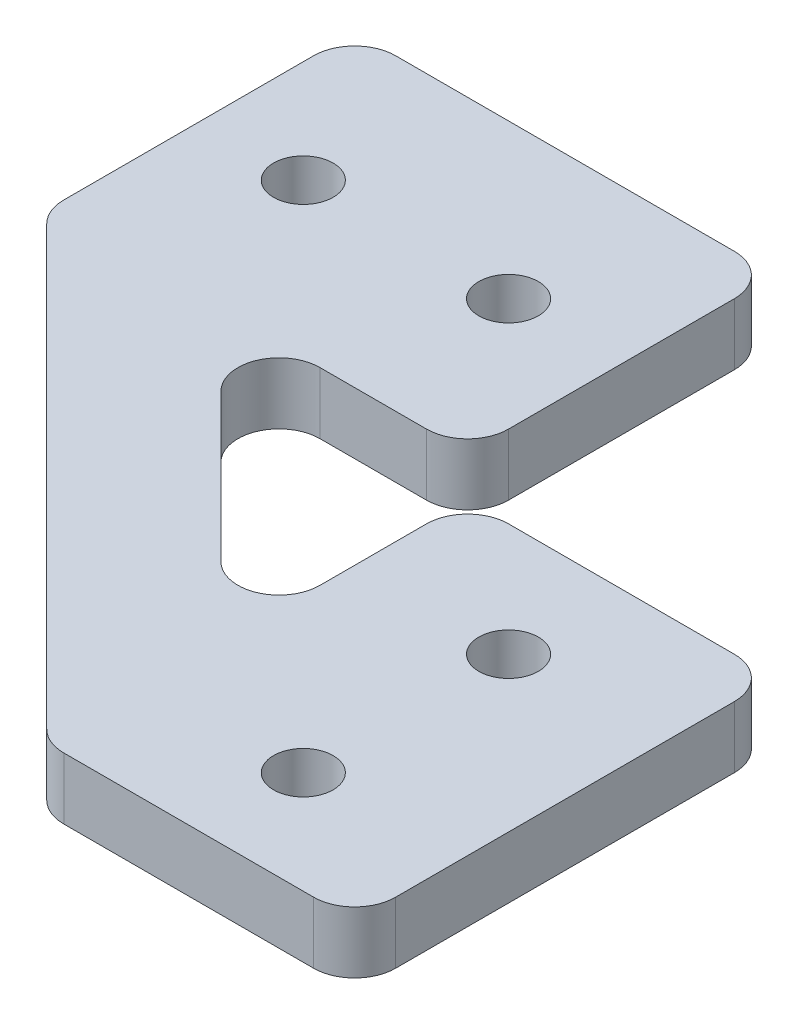
ISO-10303-21;
HEADER;
FILE_DESCRIPTION(('STEP AP214'),'2;1');
FILE_NAME('part.step','',(''),(''),'','','');
FILE_SCHEMA(('AUTOMOTIVE_DESIGN { 1 0 10303 214 1 1 1 1 }'));
ENDSEC;
DATA;
#1=APPLICATION_CONTEXT('core data for automotive mechanical design processes');
#2=APPLICATION_PROTOCOL_DEFINITION('international standard','automotive_design',2000,#1);
#3=PRODUCT_CONTEXT('',#1,'mechanical');
#4=PRODUCT('Part','Part','',(#3));
#5=PRODUCT_RELATED_PRODUCT_CATEGORY('part','',(#4));
#6=PRODUCT_DEFINITION_FORMATION('','',#4);
#7=PRODUCT_DEFINITION_CONTEXT('part definition',#1,'design');
#8=PRODUCT_DEFINITION('design','',#6,#7);
#9=PRODUCT_DEFINITION_SHAPE('','',#8);
#10=(LENGTH_UNIT() NAMED_UNIT(*) SI_UNIT(.MILLI.,.METRE.));
#11=(NAMED_UNIT(*) PLANE_ANGLE_UNIT() SI_UNIT($,.RADIAN.));
#12=(NAMED_UNIT(*) SI_UNIT($,.STERADIAN.) SOLID_ANGLE_UNIT());
#13=UNCERTAINTY_MEASURE_WITH_UNIT(LENGTH_MEASURE(1.E-05),#10,'distance_accuracy_value','');
#14=(GEOMETRIC_REPRESENTATION_CONTEXT(3) GLOBAL_UNCERTAINTY_ASSIGNED_CONTEXT((#13)) GLOBAL_UNIT_ASSIGNED_CONTEXT((#10,
#11,#12)) REPRESENTATION_CONTEXT('',''));
#15=CARTESIAN_POINT('',(0.,0.,0.));
#16=DIRECTION('',(0.,0.,1.));
#17=DIRECTION('',(1.,0.,0.));
#18=AXIS2_PLACEMENT_3D('',#15,#16,#17);
#19=CARTESIAN_POINT('',(0.,3.,0.));
#20=DIRECTION('',(0.,-1.,0.));
#21=DIRECTION('',(0.,0.,-1.));
#22=AXIS2_PLACEMENT_3D('',#19,#20,#21);
#23=PLANE('',#22);
#24=DIRECTION('',(0.,0.,-1.));
#25=VECTOR('',#24,1.);
#26=CARTESIAN_POINT('',(0.,3.,0.));
#27=LINE('',#26,#25);
#28=CARTESIAN_POINT('',(0.,3.,35.5));
#29=VERTEX_POINT('',#28);
#30=CARTESIAN_POINT('',(0.,3.,19.));
#31=VERTEX_POINT('',#30);
#32=EDGE_CURVE('E206',#29,#31,#27,.T.);
#33=ORIENTED_EDGE('',*,*,#32,.T.);
#34=CARTESIAN_POINT('',(-2.,3.,19.));
#35=DIRECTION('',(0.,-1.,0.));
#36=DIRECTION('',(0.,0.,-1.));
#37=AXIS2_PLACEMENT_3D('',#34,#35,#36);
#38=CIRCLE('',#37,2.);
#39=CARTESIAN_POINT('',(-2.,3.,17.));
#40=VERTEX_POINT('',#39);
#41=EDGE_CURVE('E267',#31,#40,#38,.F.);
#42=ORIENTED_EDGE('',*,*,#41,.T.);
#43=DIRECTION('',(1.,0.,0.));
#44=VECTOR('',#43,1.);
#45=CARTESIAN_POINT('',(0.,3.,17.));
#46=LINE('',#45,#44);
#47=CARTESIAN_POINT('',(-13.,3.,17.));
#48=VERTEX_POINT('',#47);
#49=EDGE_CURVE('E477',#48,#40,#46,.T.);
#50=ORIENTED_EDGE('',*,*,#49,.F.);
#51=CARTESIAN_POINT('',(-13.,3.,19.));
#52=DIRECTION('',(0.,-1.,0.));
#53=DIRECTION('',(0.,0.,-1.));
#54=AXIS2_PLACEMENT_3D('',#51,#52,#53);
#55=CIRCLE('',#54,2.);
#56=CARTESIAN_POINT('',(-15.,3.,19.));
#57=VERTEX_POINT('',#56);
#58=EDGE_CURVE('E264',#48,#57,#55,.F.);
#59=ORIENTED_EDGE('',*,*,#58,.T.);
#60=DIRECTION('',(0.,0.,1.));
#61=VECTOR('',#60,1.);
#62=CARTESIAN_POINT('',(-15.,3.,37.5));
#63=LINE('',#62,#61);
#64=CARTESIAN_POINT('',(-15.,3.,24.1862915010152));
#65=VERTEX_POINT('',#64);
#66=EDGE_CURVE('E368',#57,#65,#63,.T.);
#67=ORIENTED_EDGE('',*,*,#66,.T.);
#68=CARTESIAN_POINT('',(-17.,3.,24.1862915010152));
#69=DIRECTION('',(0.,-1.,0.));
#70=DIRECTION('',(0.,0.,-1.));
#71=AXIS2_PLACEMENT_3D('',#68,#69,#70);
#72=CIRCLE('',#71,2.);
#73=CARTESIAN_POINT('',(-18.4142135623731,3.,25.6005050633883));
#74=VERTEX_POINT('',#73);
#75=EDGE_CURVE('E347',#65,#74,#72,.T.);
#76=ORIENTED_EDGE('',*,*,#75,.T.);
#77=DIRECTION('',(-0.707106781186548,0.,-0.707106781186547));
#78=VECTOR('',#77,1.);
#79=CARTESIAN_POINT('',(-15.,3.,29.0147186257614));
#80=LINE('',#79,#78);
#81=CARTESIAN_POINT('',(-25.6005050633883,3.,18.4142135623731));
#82=VERTEX_POINT('',#81);
#83=EDGE_CURVE('E359',#74,#82,#80,.T.);
#84=ORIENTED_EDGE('',*,*,#83,.T.);
#85=CARTESIAN_POINT('',(-24.1862915010152,3.,17.));
#86=DIRECTION('',(0.,-1.,0.));
#87=DIRECTION('',(0.,0.,-1.));
#88=AXIS2_PLACEMENT_3D('',#85,#86,#87);
#89=CIRCLE('',#88,2.);
#90=CARTESIAN_POINT('',(-24.1862915010152,3.,15.));
#91=VERTEX_POINT('',#90);
#92=EDGE_CURVE('E54',#82,#91,#89,.T.);
#93=ORIENTED_EDGE('',*,*,#92,.T.);
#94=DIRECTION('',(1.,0.,0.));
#95=VECTOR('',#94,1.);
#96=CARTESIAN_POINT('',(-37.5,3.,15.));
#97=LINE('',#96,#95);
#98=CARTESIAN_POINT('',(-19.,3.,15.));
#99=VERTEX_POINT('',#98);
#100=EDGE_CURVE('E357',#91,#99,#97,.T.);
#101=ORIENTED_EDGE('',*,*,#100,.T.);
#102=CARTESIAN_POINT('',(-19.,3.,13.));
#103=DIRECTION('',(0.,-1.,0.));
#104=DIRECTION('',(0.,0.,-1.));
#105=AXIS2_PLACEMENT_3D('',#102,#103,#104);
#106=CIRCLE('',#105,2.);
#107=CARTESIAN_POINT('',(-17.,3.,13.));
#108=VERTEX_POINT('',#107);
#109=EDGE_CURVE('E258',#99,#108,#106,.F.);
#110=ORIENTED_EDGE('',*,*,#109,.T.);
#111=DIRECTION('',(0.,0.,1.));
#112=VECTOR('',#111,1.);
#113=CARTESIAN_POINT('',(-17.,3.,0.));
#114=LINE('',#113,#112);
#115=CARTESIAN_POINT('',(-17.,3.,2.));
#116=VERTEX_POINT('',#115);
#117=EDGE_CURVE('E483',#116,#108,#114,.T.);
#118=ORIENTED_EDGE('',*,*,#117,.F.);
#119=CARTESIAN_POINT('',(-19.,3.,2.));
#120=DIRECTION('',(0.,-1.,0.));
#121=DIRECTION('',(0.,0.,-1.));
#122=AXIS2_PLACEMENT_3D('',#119,#120,#121);
#123=CIRCLE('',#122,2.);
#124=CARTESIAN_POINT('',(-19.,3.,0.));
#125=VERTEX_POINT('',#124);
#126=EDGE_CURVE('E261',#116,#125,#123,.F.);
#127=ORIENTED_EDGE('',*,*,#126,.T.);
#128=DIRECTION('',(-1.,0.,0.));
#129=VECTOR('',#128,1.);
#130=CARTESIAN_POINT('',(0.,3.,0.));
#131=LINE('',#130,#129);
#132=CARTESIAN_POINT('',(-35.5,3.,0.));
#133=VERTEX_POINT('',#132);
#134=EDGE_CURVE('E421',#125,#133,#131,.T.);
#135=ORIENTED_EDGE('',*,*,#134,.T.);
#136=CARTESIAN_POINT('',(-35.5,3.,2.));
#137=DIRECTION('',(0.,-1.,0.));
#138=DIRECTION('',(0.,0.,-1.));
#139=AXIS2_PLACEMENT_3D('',#136,#137,#138);
#140=CIRCLE('',#139,2.);
#141=CARTESIAN_POINT('',(-37.5,3.,2.));
#142=VERTEX_POINT('',#141);
#143=EDGE_CURVE('E249',#133,#142,#140,.F.);
#144=ORIENTED_EDGE('',*,*,#143,.T.);
#145=DIRECTION('',(0.,0.,1.));
#146=VECTOR('',#145,1.);
#147=CARTESIAN_POINT('',(-37.5,3.,0.));
#148=LINE('',#147,#146);
#149=CARTESIAN_POINT('',(-37.5,3.,14.1715728752538));
#150=VERTEX_POINT('',#149);
#151=EDGE_CURVE('E369',#142,#150,#148,.T.);
#152=ORIENTED_EDGE('',*,*,#151,.T.);
#153=CARTESIAN_POINT('',(-35.5,3.,14.1715728752538));
#154=DIRECTION('',(0.,-1.,0.));
#155=DIRECTION('',(0.,0.,-1.));
#156=AXIS2_PLACEMENT_3D('',#153,#154,#155);
#157=CIRCLE('',#156,2.);
#158=CARTESIAN_POINT('',(-36.9142135623731,3.,15.5857864376269));
#159=VERTEX_POINT('',#158);
#160=EDGE_CURVE('E252',#150,#159,#157,.F.);
#161=ORIENTED_EDGE('',*,*,#160,.T.);
#162=DIRECTION('',(0.707106781186548,0.,0.707106781186547));
#163=VECTOR('',#162,1.);
#164=CARTESIAN_POINT('',(-37.5,3.,15.));
#165=LINE('',#164,#163);
#166=CARTESIAN_POINT('',(-15.5857864376269,3.,36.9142135623731));
#167=VERTEX_POINT('',#166);
#168=EDGE_CURVE('E390',#159,#167,#165,.T.);
#169=ORIENTED_EDGE('',*,*,#168,.T.);
#170=CARTESIAN_POINT('',(-14.1715728752538,3.,35.5));
#171=DIRECTION('',(0.,-1.,0.));
#172=DIRECTION('',(0.,0.,-1.));
#173=AXIS2_PLACEMENT_3D('',#170,#171,#172);
#174=CIRCLE('',#173,2.);
#175=CARTESIAN_POINT('',(-14.1715728752538,3.,37.5));
#176=VERTEX_POINT('',#175);
#177=EDGE_CURVE('E255',#167,#176,#174,.F.);
#178=ORIENTED_EDGE('',*,*,#177,.T.);
#179=DIRECTION('',(1.,0.,0.));
#180=VECTOR('',#179,1.);
#181=CARTESIAN_POINT('',(0.,3.,37.5));
#182=LINE('',#181,#180);
#183=CARTESIAN_POINT('',(-1.99999999999999,3.,37.5));
#184=VERTEX_POINT('',#183);
#185=EDGE_CURVE('E209',#176,#184,#182,.T.);
#186=ORIENTED_EDGE('',*,*,#185,.T.);
#187=CARTESIAN_POINT('',(-2.,3.,35.5));
#188=DIRECTION('',(0.,-1.,0.));
#189=DIRECTION('',(0.,0.,-1.));
#190=AXIS2_PLACEMENT_3D('',#187,#188,#189);
#191=CIRCLE('',#190,2.);
#192=EDGE_CURVE('E246',#184,#29,#191,.F.);
#193=ORIENTED_EDGE('',*,*,#192,.T.);
#194=EDGE_LOOP('',(#33,#42,#50,#59,#67,#76,#84,#93,#101,#110,#118,#127,#135,#144,#152,#161,#169,
#178,#186,#193));
#195=FACE_BOUND('',#194,.T.);
#196=CARTESIAN_POINT('',(-22.5,3.,7.5));
#197=DIRECTION('',(0.,1.,0.));
#198=DIRECTION('',(0.,0.,1.));
#199=AXIS2_PLACEMENT_3D('',#196,#197,#198);
#200=CIRCLE('',#199,1.45);
#201=CARTESIAN_POINT('',(-22.5,3.,8.95));
#202=VERTEX_POINT('',#201);
#203=EDGE_CURVE('E218',#202,#202,#200,.T.);
#204=ORIENTED_EDGE('',*,*,#203,.F.);
#205=EDGE_LOOP('',(#204));
#206=FACE_BOUND('',#205,.T.);
#207=CARTESIAN_POINT('',(-32.5,3.,7.5));
#208=DIRECTION('',(0.,1.,0.));
#209=DIRECTION('',(0.,0.,1.));
#210=AXIS2_PLACEMENT_3D('',#207,#208,#209);
#211=CIRCLE('',#210,1.45);
#212=CARTESIAN_POINT('',(-32.5,3.,8.95));
#213=VERTEX_POINT('',#212);
#214=EDGE_CURVE('E409',#213,#213,#211,.T.);
#215=ORIENTED_EDGE('',*,*,#214,.F.);
#216=EDGE_LOOP('',(#215));
#217=FACE_BOUND('',#216,.T.);
#218=CARTESIAN_POINT('',(-7.5,3.,22.5));
#219=DIRECTION('',(0.,1.,0.));
#220=DIRECTION('',(0.,0.,1.));
#221=AXIS2_PLACEMENT_3D('',#218,#219,#220);
#222=CIRCLE('',#221,1.45);
#223=CARTESIAN_POINT('',(-7.5,3.,23.95));
#224=VERTEX_POINT('',#223);
#225=EDGE_CURVE('E401',#224,#224,#222,.T.);
#226=ORIENTED_EDGE('',*,*,#225,.F.);
#227=EDGE_LOOP('',(#226));
#228=FACE_BOUND('',#227,.T.);
#229=CARTESIAN_POINT('',(-7.5,3.,32.5));
#230=DIRECTION('',(0.,1.,0.));
#231=DIRECTION('',(0.,0.,1.));
#232=AXIS2_PLACEMENT_3D('',#229,#230,#231);
#233=CIRCLE('',#232,1.45);
#234=CARTESIAN_POINT('',(-7.5,3.,33.95));
#235=VERTEX_POINT('',#234);
#236=EDGE_CURVE('E384',#235,#235,#233,.T.);
#237=ORIENTED_EDGE('',*,*,#236,.F.);
#238=EDGE_LOOP('',(#237));
#239=FACE_BOUND('',#238,.T.);
#240=ADVANCED_FACE('F45',(#195,#206,#217,#228,#239),#23,.F.);
#241=CARTESIAN_POINT('',(0.,0.,0.));
#242=DIRECTION('',(0.,-1.,0.));
#243=DIRECTION('',(0.,0.,-1.));
#244=AXIS2_PLACEMENT_3D('',#241,#242,#243);
#245=PLANE('',#244);
#246=DIRECTION('',(1.,0.,0.));
#247=VECTOR('',#246,1.);
#248=CARTESIAN_POINT('',(0.,0.,17.));
#249=LINE('',#248,#247);
#250=CARTESIAN_POINT('',(-13.,0.,17.));
#251=VERTEX_POINT('',#250);
#252=CARTESIAN_POINT('',(-2.,0.,17.));
#253=VERTEX_POINT('',#252);
#254=EDGE_CURVE('E394',#251,#253,#249,.T.);
#255=ORIENTED_EDGE('',*,*,#254,.T.);
#256=CARTESIAN_POINT('',(-2.,0.,19.));
#257=DIRECTION('',(0.,-1.,0.));
#258=DIRECTION('',(0.,0.,-1.));
#259=AXIS2_PLACEMENT_3D('',#256,#257,#258);
#260=CIRCLE('',#259,2.);
#261=CARTESIAN_POINT('',(0.,0.,19.));
#262=VERTEX_POINT('',#261);
#263=EDGE_CURVE('E215',#253,#262,#260,.T.);
#264=ORIENTED_EDGE('',*,*,#263,.T.);
#265=DIRECTION('',(0.,0.,-1.));
#266=VECTOR('',#265,1.);
#267=CARTESIAN_POINT('',(0.,0.,0.));
#268=LINE('',#267,#266);
#269=CARTESIAN_POINT('',(0.,0.,35.5));
#270=VERTEX_POINT('',#269);
#271=EDGE_CURVE('E203',#270,#262,#268,.T.);
#272=ORIENTED_EDGE('',*,*,#271,.F.);
#273=CARTESIAN_POINT('',(-2.,0.,35.5));
#274=DIRECTION('',(0.,-1.,0.));
#275=DIRECTION('',(0.,0.,-1.));
#276=AXIS2_PLACEMENT_3D('',#273,#274,#275);
#277=CIRCLE('',#276,2.);
#278=CARTESIAN_POINT('',(-1.99999999999999,0.,37.5));
#279=VERTEX_POINT('',#278);
#280=EDGE_CURVE('E185',#270,#279,#277,.T.);
#281=ORIENTED_EDGE('',*,*,#280,.T.);
#282=DIRECTION('',(1.,0.,0.));
#283=VECTOR('',#282,1.);
#284=CARTESIAN_POINT('',(0.,0.,37.5));
#285=LINE('',#284,#283);
#286=CARTESIAN_POINT('',(-14.1715728752538,0.,37.5));
#287=VERTEX_POINT('',#286);
#288=EDGE_CURVE('E241',#287,#279,#285,.T.);
#289=ORIENTED_EDGE('',*,*,#288,.F.);
#290=CARTESIAN_POINT('',(-14.1715728752538,0.,35.5));
#291=DIRECTION('',(0.,-1.,0.));
#292=DIRECTION('',(0.,0.,-1.));
#293=AXIS2_PLACEMENT_3D('',#290,#291,#292);
#294=CIRCLE('',#293,2.);
#295=CARTESIAN_POINT('',(-15.5857864376269,0.,36.9142135623731));
#296=VERTEX_POINT('',#295);
#297=EDGE_CURVE('E280',#287,#296,#294,.T.);
#298=ORIENTED_EDGE('',*,*,#297,.T.);
#299=DIRECTION('',(0.707106781186548,0.,0.707106781186547));
#300=VECTOR('',#299,1.);
#301=CARTESIAN_POINT('',(-37.5,0.,15.));
#302=LINE('',#301,#300);
#303=CARTESIAN_POINT('',(-36.9142135623731,0.,15.5857864376269));
#304=VERTEX_POINT('',#303);
#305=EDGE_CURVE('E379',#304,#296,#302,.T.);
#306=ORIENTED_EDGE('',*,*,#305,.F.);
#307=CARTESIAN_POINT('',(-35.5,0.,14.1715728752538));
#308=DIRECTION('',(0.,-1.,0.));
#309=DIRECTION('',(0.,0.,-1.));
#310=AXIS2_PLACEMENT_3D('',#307,#308,#309);
#311=CIRCLE('',#310,2.);
#312=CARTESIAN_POINT('',(-37.5,0.,14.1715728752538));
#313=VERTEX_POINT('',#312);
#314=EDGE_CURVE('E277',#304,#313,#311,.T.);
#315=ORIENTED_EDGE('',*,*,#314,.T.);
#316=DIRECTION('',(0.,0.,1.));
#317=VECTOR('',#316,1.);
#318=CARTESIAN_POINT('',(-37.5,0.,0.));
#319=LINE('',#318,#317);
#320=CARTESIAN_POINT('',(-37.5,0.,2.));
#321=VERTEX_POINT('',#320);
#322=EDGE_CURVE('E223',#321,#313,#319,.T.);
#323=ORIENTED_EDGE('',*,*,#322,.F.);
#324=CARTESIAN_POINT('',(-35.5,0.,2.));
#325=DIRECTION('',(0.,-1.,0.));
#326=DIRECTION('',(0.,0.,-1.));
#327=AXIS2_PLACEMENT_3D('',#324,#325,#326);
#328=CIRCLE('',#327,2.);
#329=CARTESIAN_POINT('',(-35.5,0.,0.));
#330=VERTEX_POINT('',#329);
#331=EDGE_CURVE('E195',#321,#330,#328,.T.);
#332=ORIENTED_EDGE('',*,*,#331,.T.);
#333=DIRECTION('',(-1.,0.,0.));
#334=VECTOR('',#333,1.);
#335=CARTESIAN_POINT('',(0.,0.,0.));
#336=LINE('',#335,#334);
#337=CARTESIAN_POINT('',(-19.,0.,0.));
#338=VERTEX_POINT('',#337);
#339=EDGE_CURVE('E217',#338,#330,#336,.T.);
#340=ORIENTED_EDGE('',*,*,#339,.F.);
#341=CARTESIAN_POINT('',(-19.,0.,2.));
#342=DIRECTION('',(0.,-1.,0.));
#343=DIRECTION('',(0.,0.,-1.));
#344=AXIS2_PLACEMENT_3D('',#341,#342,#343);
#345=CIRCLE('',#344,2.);
#346=CARTESIAN_POINT('',(-17.,0.,2.));
#347=VERTEX_POINT('',#346);
#348=EDGE_CURVE('E286',#338,#347,#345,.T.);
#349=ORIENTED_EDGE('',*,*,#348,.T.);
#350=DIRECTION('',(0.,0.,1.));
#351=VECTOR('',#350,1.);
#352=CARTESIAN_POINT('',(-17.,0.,0.));
#353=LINE('',#352,#351);
#354=CARTESIAN_POINT('',(-17.,0.,13.));
#355=VERTEX_POINT('',#354);
#356=EDGE_CURVE('E469',#347,#355,#353,.T.);
#357=ORIENTED_EDGE('',*,*,#356,.T.);
#358=CARTESIAN_POINT('',(-19.,0.,13.));
#359=DIRECTION('',(0.,-1.,0.));
#360=DIRECTION('',(0.,0.,-1.));
#361=AXIS2_PLACEMENT_3D('',#358,#359,#360);
#362=CIRCLE('',#361,2.);
#363=CARTESIAN_POINT('',(-19.,0.,15.));
#364=VERTEX_POINT('',#363);
#365=EDGE_CURVE('E283',#355,#364,#362,.T.);
#366=ORIENTED_EDGE('',*,*,#365,.T.);
#367=DIRECTION('',(1.,0.,0.));
#368=VECTOR('',#367,1.);
#369=CARTESIAN_POINT('',(-37.5,0.,15.));
#370=LINE('',#369,#368);
#371=CARTESIAN_POINT('',(-24.1862915010152,0.,15.));
#372=VERTEX_POINT('',#371);
#373=EDGE_CURVE('E234',#372,#364,#370,.T.);
#374=ORIENTED_EDGE('',*,*,#373,.F.);
#375=CARTESIAN_POINT('',(-24.1862915010152,0.,17.));
#376=DIRECTION('',(0.,-1.,0.));
#377=DIRECTION('',(0.,0.,-1.));
#378=AXIS2_PLACEMENT_3D('',#375,#376,#377);
#379=CIRCLE('',#378,2.);
#380=CARTESIAN_POINT('',(-25.6005050633883,0.,18.4142135623731));
#381=VERTEX_POINT('',#380);
#382=EDGE_CURVE('E11',#372,#381,#379,.F.);
#383=ORIENTED_EDGE('',*,*,#382,.T.);
#384=DIRECTION('',(-0.707106781186548,0.,-0.707106781186547));
#385=VECTOR('',#384,1.);
#386=CARTESIAN_POINT('',(-15.,0.,29.0147186257614));
#387=LINE('',#386,#385);
#388=CARTESIAN_POINT('',(-18.4142135623731,0.,25.6005050633883));
#389=VERTEX_POINT('',#388);
#390=EDGE_CURVE('E373',#389,#381,#387,.T.);
#391=ORIENTED_EDGE('',*,*,#390,.F.);
#392=CARTESIAN_POINT('',(-17.,0.,24.1862915010152));
#393=DIRECTION('',(0.,-1.,0.));
#394=DIRECTION('',(0.,0.,-1.));
#395=AXIS2_PLACEMENT_3D('',#392,#393,#394);
#396=CIRCLE('',#395,2.);
#397=CARTESIAN_POINT('',(-15.,0.,24.1862915010152));
#398=VERTEX_POINT('',#397);
#399=EDGE_CURVE('E61',#389,#398,#396,.F.);
#400=ORIENTED_EDGE('',*,*,#399,.T.);
#401=DIRECTION('',(0.,0.,1.));
#402=VECTOR('',#401,1.);
#403=CARTESIAN_POINT('',(-15.,0.,37.5));
#404=LINE('',#403,#402);
#405=CARTESIAN_POINT('',(-15.,0.,19.));
#406=VERTEX_POINT('',#405);
#407=EDGE_CURVE('E238',#406,#398,#404,.T.);
#408=ORIENTED_EDGE('',*,*,#407,.F.);
#409=CARTESIAN_POINT('',(-13.,0.,19.));
#410=DIRECTION('',(0.,-1.,0.));
#411=DIRECTION('',(0.,0.,-1.));
#412=AXIS2_PLACEMENT_3D('',#409,#410,#411);
#413=CIRCLE('',#412,2.);
#414=EDGE_CURVE('E69',#406,#251,#413,.T.);
#415=ORIENTED_EDGE('',*,*,#414,.T.);
#416=EDGE_LOOP('',(#255,#264,#272,#281,#289,#298,#306,#315,#323,#332,#340,#349,#357,#366,#374,
#383,#391,#400,#408,#415));
#417=FACE_BOUND('',#416,.T.);
#418=CARTESIAN_POINT('',(-7.5,0.,22.5));
#419=DIRECTION('',(0.,1.,0.));
#420=DIRECTION('',(0.,0.,1.));
#421=AXIS2_PLACEMENT_3D('',#418,#419,#420);
#422=CIRCLE('',#421,1.45);
#423=CARTESIAN_POINT('',(-7.5,0.,23.95));
#424=VERTEX_POINT('',#423);
#425=EDGE_CURVE('E399',#424,#424,#422,.T.);
#426=ORIENTED_EDGE('',*,*,#425,.T.);
#427=EDGE_LOOP('',(#426));
#428=FACE_BOUND('',#427,.T.);
#429=CARTESIAN_POINT('',(-22.5,0.,7.5));
#430=DIRECTION('',(0.,1.,0.));
#431=DIRECTION('',(0.,0.,1.));
#432=AXIS2_PLACEMENT_3D('',#429,#430,#431);
#433=CIRCLE('',#432,1.45);
#434=CARTESIAN_POINT('',(-22.5,0.,8.95));
#435=VERTEX_POINT('',#434);
#436=EDGE_CURVE('E226',#435,#435,#433,.T.);
#437=ORIENTED_EDGE('',*,*,#436,.T.);
#438=EDGE_LOOP('',(#437));
#439=FACE_BOUND('',#438,.T.);
#440=CARTESIAN_POINT('',(-32.5,0.,7.5));
#441=DIRECTION('',(0.,1.,0.));
#442=DIRECTION('',(0.,0.,1.));
#443=AXIS2_PLACEMENT_3D('',#440,#441,#442);
#444=CIRCLE('',#443,1.45);
#445=CARTESIAN_POINT('',(-32.5,0.,8.95));
#446=VERTEX_POINT('',#445);
#447=EDGE_CURVE('E405',#446,#446,#444,.T.);
#448=ORIENTED_EDGE('',*,*,#447,.T.);
#449=EDGE_LOOP('',(#448));
#450=FACE_BOUND('',#449,.T.);
#451=CARTESIAN_POINT('',(-7.5,0.,32.5));
#452=DIRECTION('',(0.,1.,0.));
#453=DIRECTION('',(0.,0.,1.));
#454=AXIS2_PLACEMENT_3D('',#451,#452,#453);
#455=CIRCLE('',#454,1.45);
#456=CARTESIAN_POINT('',(-7.5,0.,33.95));
#457=VERTEX_POINT('',#456);
#458=EDGE_CURVE('E378',#457,#457,#455,.T.);
#459=ORIENTED_EDGE('',*,*,#458,.T.);
#460=EDGE_LOOP('',(#459));
#461=FACE_BOUND('',#460,.T.);
#462=ADVANCED_FACE('F212',(#417,#428,#439,#450,#461),#245,.T.);
#463=CARTESIAN_POINT('',(0.,3.,0.));
#464=DIRECTION('',(-1.,0.,0.));
#465=DIRECTION('',(0.,0.,1.));
#466=AXIS2_PLACEMENT_3D('',#463,#464,#465);
#467=PLANE('',#466);
#468=ORIENTED_EDGE('',*,*,#271,.T.);
#469=DIRECTION('',(0.,1.,0.));
#470=VECTOR('',#469,1.);
#471=CARTESIAN_POINT('',(0.,3.,19.));
#472=LINE('',#471,#470);
#473=EDGE_CURVE('E208',#262,#31,#472,.T.);
#474=ORIENTED_EDGE('',*,*,#473,.T.);
#475=ORIENTED_EDGE('',*,*,#32,.F.);
#476=DIRECTION('',(0.,-1.,0.));
#477=VECTOR('',#476,1.);
#478=CARTESIAN_POINT('',(0.,3.,35.5));
#479=LINE('',#478,#477);
#480=EDGE_CURVE('E189',#29,#270,#479,.T.);
#481=ORIENTED_EDGE('',*,*,#480,.T.);
#482=EDGE_LOOP('',(#468,#474,#475,#481));
#483=FACE_BOUND('',#482,.T.);
#484=ADVANCED_FACE('F201',(#483),#467,.F.);
#485=CARTESIAN_POINT('',(0.,3.,0.));
#486=DIRECTION('',(0.,0.,1.));
#487=DIRECTION('',(1.,0.,0.));
#488=AXIS2_PLACEMENT_3D('',#485,#486,#487);
#489=PLANE('',#488);
#490=ORIENTED_EDGE('',*,*,#134,.F.);
#491=DIRECTION('',(0.,1.,0.));
#492=VECTOR('',#491,1.);
#493=CARTESIAN_POINT('',(-19.,3.,0.));
#494=LINE('',#493,#492);
#495=EDGE_CURVE('E310',#125,#338,#494,.F.);
#496=ORIENTED_EDGE('',*,*,#495,.T.);
#497=ORIENTED_EDGE('',*,*,#339,.T.);
#498=DIRECTION('',(0.,-1.,0.));
#499=VECTOR('',#498,1.);
#500=CARTESIAN_POINT('',(-35.5,3.,0.));
#501=LINE('',#500,#499);
#502=EDGE_CURVE('E307',#330,#133,#501,.F.);
#503=ORIENTED_EDGE('',*,*,#502,.T.);
#504=EDGE_LOOP('',(#490,#496,#497,#503));
#505=FACE_BOUND('',#504,.T.);
#506=ADVANCED_FACE('F462',(#505),#489,.F.);
#507=CARTESIAN_POINT('',(-37.5,3.,0.));
#508=DIRECTION('',(1.,0.,0.));
#509=DIRECTION('',(0.,0.,-1.));
#510=AXIS2_PLACEMENT_3D('',#507,#508,#509);
#511=PLANE('',#510);
#512=ORIENTED_EDGE('',*,*,#322,.T.);
#513=DIRECTION('',(0.,-1.,0.));
#514=VECTOR('',#513,1.);
#515=CARTESIAN_POINT('',(-37.5,3.,14.1715728752538));
#516=LINE('',#515,#514);
#517=EDGE_CURVE('E337',#313,#150,#516,.F.);
#518=ORIENTED_EDGE('',*,*,#517,.T.);
#519=ORIENTED_EDGE('',*,*,#151,.F.);
#520=DIRECTION('',(0.,-1.,0.));
#521=VECTOR('',#520,1.);
#522=CARTESIAN_POINT('',(-37.5,3.,2.));
#523=LINE('',#522,#521);
#524=EDGE_CURVE('E333',#142,#321,#523,.T.);
#525=ORIENTED_EDGE('',*,*,#524,.T.);
#526=EDGE_LOOP('',(#512,#518,#519,#525));
#527=FACE_BOUND('',#526,.T.);
#528=ADVANCED_FACE('F451',(#527),#511,.F.);
#529=CARTESIAN_POINT('',(-37.5,3.,15.));
#530=DIRECTION('',(0.,0.,-1.));
#531=DIRECTION('',(-1.,0.,0.));
#532=AXIS2_PLACEMENT_3D('',#529,#530,#531);
#533=PLANE('',#532);
#534=ORIENTED_EDGE('',*,*,#373,.T.);
#535=DIRECTION('',(0.,1.,0.));
#536=VECTOR('',#535,1.);
#537=CARTESIAN_POINT('',(-19.,3.,15.));
#538=LINE('',#537,#536);
#539=EDGE_CURVE('E316',#364,#99,#538,.T.);
#540=ORIENTED_EDGE('',*,*,#539,.T.);
#541=ORIENTED_EDGE('',*,*,#100,.F.);
#542=DIRECTION('',(0.,1.,0.));
#543=VECTOR('',#542,1.);
#544=CARTESIAN_POINT('',(-24.1862915010152,3.,15.));
#545=LINE('',#544,#543);
#546=EDGE_CURVE('E313',#91,#372,#545,.F.);
#547=ORIENTED_EDGE('',*,*,#546,.T.);
#548=EDGE_LOOP('',(#534,#540,#541,#547));
#549=FACE_BOUND('',#548,.T.);
#550=ADVANCED_FACE('F364',(#549),#533,.F.);
#551=CARTESIAN_POINT('',(-15.,3.,37.5));
#552=DIRECTION('',(1.,0.,0.));
#553=DIRECTION('',(0.,0.,-1.));
#554=AXIS2_PLACEMENT_3D('',#551,#552,#553);
#555=PLANE('',#554);
#556=ORIENTED_EDGE('',*,*,#66,.F.);
#557=DIRECTION('',(0.,-1.,0.));
#558=VECTOR('',#557,1.);
#559=CARTESIAN_POINT('',(-15.,3.,19.));
#560=LINE('',#559,#558);
#561=EDGE_CURVE('E297',#57,#406,#560,.T.);
#562=ORIENTED_EDGE('',*,*,#561,.T.);
#563=ORIENTED_EDGE('',*,*,#407,.T.);
#564=DIRECTION('',(0.,1.,0.));
#565=VECTOR('',#564,1.);
#566=CARTESIAN_POINT('',(-15.,3.,24.1862915010152));
#567=LINE('',#566,#565);
#568=EDGE_CURVE('E293',#398,#65,#567,.T.);
#569=ORIENTED_EDGE('',*,*,#568,.T.);
#570=EDGE_LOOP('',(#556,#562,#563,#569));
#571=FACE_BOUND('',#570,.T.);
#572=ADVANCED_FACE('F510',(#571),#555,.F.);
#573=CARTESIAN_POINT('',(0.,3.,37.5));
#574=DIRECTION('',(0.,0.,-1.));
#575=DIRECTION('',(-1.,0.,0.));
#576=AXIS2_PLACEMENT_3D('',#573,#574,#575);
#577=PLANE('',#576);
#578=ORIENTED_EDGE('',*,*,#185,.F.);
#579=DIRECTION('',(0.,-1.,0.));
#580=VECTOR('',#579,1.);
#581=CARTESIAN_POINT('',(-14.1715728752538,0.,37.5));
#582=LINE('',#581,#580);
#583=EDGE_CURVE('E322',#176,#287,#582,.T.);
#584=ORIENTED_EDGE('',*,*,#583,.T.);
#585=ORIENTED_EDGE('',*,*,#288,.T.);
#586=DIRECTION('',(0.,-1.,0.));
#587=VECTOR('',#586,1.);
#588=CARTESIAN_POINT('',(-2.,3.,37.5));
#589=LINE('',#588,#587);
#590=EDGE_CURVE('E190',#279,#184,#589,.F.);
#591=ORIENTED_EDGE('',*,*,#590,.T.);
#592=EDGE_LOOP('',(#578,#584,#585,#591));
#593=FACE_BOUND('',#592,.T.);
#594=ADVANCED_FACE('F436',(#593),#577,.F.);
#595=CARTESIAN_POINT('',(-22.5,3.,7.5));
#596=DIRECTION('',(0.,-1.,0.));
#597=DIRECTION('',(0.,0.,-1.));
#598=AXIS2_PLACEMENT_3D('',#595,#596,#597);
#599=CYLINDRICAL_SURFACE('',#598,1.45);
#600=ORIENTED_EDGE('',*,*,#203,.T.);
#601=EDGE_LOOP('',(#600));
#602=FACE_BOUND('',#601,.T.);
#603=ORIENTED_EDGE('',*,*,#436,.F.);
#604=EDGE_LOOP('',(#603));
#605=FACE_BOUND('',#604,.T.);
#606=ADVANCED_FACE('F505',(#602,#605),#599,.F.);
#607=CARTESIAN_POINT('',(-32.5,3.,7.5));
#608=DIRECTION('',(0.,-1.,0.));
#609=DIRECTION('',(0.,0.,-1.));
#610=AXIS2_PLACEMENT_3D('',#607,#608,#609);
#611=CYLINDRICAL_SURFACE('',#610,1.45);
#612=ORIENTED_EDGE('',*,*,#214,.T.);
#613=EDGE_LOOP('',(#612));
#614=FACE_BOUND('',#613,.T.);
#615=ORIENTED_EDGE('',*,*,#447,.F.);
#616=EDGE_LOOP('',(#615));
#617=FACE_BOUND('',#616,.T.);
#618=ADVANCED_FACE('F641',(#614,#617),#611,.F.);
#619=CARTESIAN_POINT('',(-7.5,3.,22.5));
#620=DIRECTION('',(0.,-1.,0.));
#621=DIRECTION('',(0.,0.,-1.));
#622=AXIS2_PLACEMENT_3D('',#619,#620,#621);
#623=CYLINDRICAL_SURFACE('',#622,1.45);
#624=ORIENTED_EDGE('',*,*,#225,.T.);
#625=EDGE_LOOP('',(#624));
#626=FACE_BOUND('',#625,.T.);
#627=ORIENTED_EDGE('',*,*,#425,.F.);
#628=EDGE_LOOP('',(#627));
#629=FACE_BOUND('',#628,.T.);
#630=ADVANCED_FACE('F632',(#626,#629),#623,.F.);
#631=CARTESIAN_POINT('',(-7.5,3.,32.5));
#632=DIRECTION('',(0.,-1.,0.));
#633=DIRECTION('',(0.,0.,-1.));
#634=AXIS2_PLACEMENT_3D('',#631,#632,#633);
#635=CYLINDRICAL_SURFACE('',#634,1.45);
#636=ORIENTED_EDGE('',*,*,#236,.T.);
#637=EDGE_LOOP('',(#636));
#638=FACE_BOUND('',#637,.T.);
#639=ORIENTED_EDGE('',*,*,#458,.F.);
#640=EDGE_LOOP('',(#639));
#641=FACE_BOUND('',#640,.T.);
#642=ADVANCED_FACE('F624',(#638,#641),#635,.F.);
#643=CARTESIAN_POINT('',(-15.,0.,29.0147186257614));
#644=DIRECTION('',(0.707106781186547,0.,-0.707106781186548));
#645=DIRECTION('',(-0.707106781186548,0.,-0.707106781186547));
#646=AXIS2_PLACEMENT_3D('',#643,#644,#645);
#647=PLANE('',#646);
#648=ORIENTED_EDGE('',*,*,#83,.F.);
#649=DIRECTION('',(0.,1.,0.));
#650=VECTOR('',#649,1.);
#651=CARTESIAN_POINT('',(-18.4142135623731,0.,25.6005050633883));
#652=LINE('',#651,#650);
#653=EDGE_CURVE('E344',#74,#389,#652,.F.);
#654=ORIENTED_EDGE('',*,*,#653,.T.);
#655=ORIENTED_EDGE('',*,*,#390,.T.);
#656=DIRECTION('',(0.,1.,0.));
#657=VECTOR('',#656,1.);
#658=CARTESIAN_POINT('',(-25.6005050633883,0.,18.4142135623731));
#659=LINE('',#658,#657);
#660=EDGE_CURVE('E340',#381,#82,#659,.T.);
#661=ORIENTED_EDGE('',*,*,#660,.T.);
#662=EDGE_LOOP('',(#648,#654,#655,#661));
#663=FACE_BOUND('',#662,.T.);
#664=ADVANCED_FACE('F375',(#663),#647,.T.);
#665=CARTESIAN_POINT('',(-37.5,0.,15.));
#666=DIRECTION('',(-0.707106781186547,0.,0.707106781186548));
#667=DIRECTION('',(0.707106781186548,0.,0.707106781186547));
#668=AXIS2_PLACEMENT_3D('',#665,#666,#667);
#669=PLANE('',#668);
#670=ORIENTED_EDGE('',*,*,#305,.T.);
#671=DIRECTION('',(0.,-1.,0.));
#672=VECTOR('',#671,1.);
#673=CARTESIAN_POINT('',(-15.5857864376269,3.,36.9142135623731));
#674=LINE('',#673,#672);
#675=EDGE_CURVE('E330',#296,#167,#674,.F.);
#676=ORIENTED_EDGE('',*,*,#675,.T.);
#677=ORIENTED_EDGE('',*,*,#168,.F.);
#678=DIRECTION('',(0.,-1.,0.));
#679=VECTOR('',#678,1.);
#680=CARTESIAN_POINT('',(-36.9142135623731,0.,15.5857864376269));
#681=LINE('',#680,#679);
#682=EDGE_CURVE('E326',#159,#304,#681,.T.);
#683=ORIENTED_EDGE('',*,*,#682,.T.);
#684=EDGE_LOOP('',(#670,#676,#677,#683));
#685=FACE_BOUND('',#684,.T.);
#686=ADVANCED_FACE('F442',(#685),#669,.T.);
#687=CARTESIAN_POINT('',(0.,0.,17.));
#688=DIRECTION('',(0.,0.,1.));
#689=DIRECTION('',(1.,0.,0.));
#690=AXIS2_PLACEMENT_3D('',#687,#688,#689);
#691=PLANE('',#690);
#692=ORIENTED_EDGE('',*,*,#49,.T.);
#693=DIRECTION('',(0.,1.,0.));
#694=VECTOR('',#693,1.);
#695=CARTESIAN_POINT('',(-2.,0.,17.));
#696=LINE('',#695,#694);
#697=EDGE_CURVE('E196',#40,#253,#696,.F.);
#698=ORIENTED_EDGE('',*,*,#697,.T.);
#699=ORIENTED_EDGE('',*,*,#254,.F.);
#700=DIRECTION('',(0.,-1.,0.));
#701=VECTOR('',#700,1.);
#702=CARTESIAN_POINT('',(-13.,0.,17.));
#703=LINE('',#702,#701);
#704=EDGE_CURVE('E270',#251,#48,#703,.F.);
#705=ORIENTED_EDGE('',*,*,#704,.T.);
#706=EDGE_LOOP('',(#692,#698,#699,#705));
#707=FACE_BOUND('',#706,.T.);
#708=ADVANCED_FACE('F601',(#707),#691,.F.);
#709=CARTESIAN_POINT('',(-17.,0.,0.));
#710=DIRECTION('',(-1.,0.,0.));
#711=DIRECTION('',(0.,0.,1.));
#712=AXIS2_PLACEMENT_3D('',#709,#710,#711);
#713=PLANE('',#712);
#714=ORIENTED_EDGE('',*,*,#356,.F.);
#715=DIRECTION('',(0.,1.,0.));
#716=VECTOR('',#715,1.);
#717=CARTESIAN_POINT('',(-17.,0.,2.));
#718=LINE('',#717,#716);
#719=EDGE_CURVE('E303',#347,#116,#718,.T.);
#720=ORIENTED_EDGE('',*,*,#719,.T.);
#721=ORIENTED_EDGE('',*,*,#117,.T.);
#722=DIRECTION('',(0.,1.,0.));
#723=VECTOR('',#722,1.);
#724=CARTESIAN_POINT('',(-17.,0.,13.));
#725=LINE('',#724,#723);
#726=EDGE_CURVE('E300',#108,#355,#725,.F.);
#727=ORIENTED_EDGE('',*,*,#726,.T.);
#728=EDGE_LOOP('',(#714,#720,#721,#727));
#729=FACE_BOUND('',#728,.T.);
#730=ADVANCED_FACE('F472',(#729),#713,.F.);
#731=CARTESIAN_POINT('',(-2.,3.,19.));
#732=DIRECTION('',(0.,1.,0.));
#733=DIRECTION('',(0.,0.,1.));
#734=AXIS2_PLACEMENT_3D('',#731,#732,#733);
#735=CYLINDRICAL_SURFACE('',#734,2.);
#736=ORIENTED_EDGE('',*,*,#263,.F.);
#737=ORIENTED_EDGE('',*,*,#697,.F.);
#738=ORIENTED_EDGE('',*,*,#41,.F.);
#739=ORIENTED_EDGE('',*,*,#473,.F.);
#740=EDGE_LOOP('',(#736,#737,#738,#739));
#741=FACE_BOUND('',#740,.T.);
#742=ADVANCED_FACE('F522',(#741),#735,.T.);
#743=CARTESIAN_POINT('',(-13.,3.,19.));
#744=DIRECTION('',(0.,-1.,0.));
#745=DIRECTION('',(0.,0.,-1.));
#746=AXIS2_PLACEMENT_3D('',#743,#744,#745);
#747=CYLINDRICAL_SURFACE('',#746,2.);
#748=ORIENTED_EDGE('',*,*,#58,.F.);
#749=ORIENTED_EDGE('',*,*,#704,.F.);
#750=ORIENTED_EDGE('',*,*,#414,.F.);
#751=ORIENTED_EDGE('',*,*,#561,.F.);
#752=EDGE_LOOP('',(#748,#749,#750,#751));
#753=FACE_BOUND('',#752,.T.);
#754=ADVANCED_FACE('F495',(#753),#747,.T.);
#755=CARTESIAN_POINT('',(-19.,0.,2.));
#756=DIRECTION('',(0.,1.,0.));
#757=DIRECTION('',(0.,0.,1.));
#758=AXIS2_PLACEMENT_3D('',#755,#756,#757);
#759=CYLINDRICAL_SURFACE('',#758,2.);
#760=ORIENTED_EDGE('',*,*,#348,.F.);
#761=ORIENTED_EDGE('',*,*,#495,.F.);
#762=ORIENTED_EDGE('',*,*,#126,.F.);
#763=ORIENTED_EDGE('',*,*,#719,.F.);
#764=EDGE_LOOP('',(#760,#761,#762,#763));
#765=FACE_BOUND('',#764,.T.);
#766=ADVANCED_FACE('F465',(#765),#759,.T.);
#767=CARTESIAN_POINT('',(-19.,3.,13.));
#768=DIRECTION('',(0.,1.,0.));
#769=DIRECTION('',(0.,0.,1.));
#770=AXIS2_PLACEMENT_3D('',#767,#768,#769);
#771=CYLINDRICAL_SURFACE('',#770,2.);
#772=ORIENTED_EDGE('',*,*,#365,.F.);
#773=ORIENTED_EDGE('',*,*,#726,.F.);
#774=ORIENTED_EDGE('',*,*,#109,.F.);
#775=ORIENTED_EDGE('',*,*,#539,.F.);
#776=EDGE_LOOP('',(#772,#773,#774,#775));
#777=FACE_BOUND('',#776,.T.);
#778=ADVANCED_FACE('F487',(#777),#771,.T.);
#779=CARTESIAN_POINT('',(-14.1715728752538,3.,35.5));
#780=DIRECTION('',(0.,1.,0.));
#781=DIRECTION('',(0.,0.,1.));
#782=AXIS2_PLACEMENT_3D('',#779,#780,#781);
#783=CYLINDRICAL_SURFACE('',#782,2.);
#784=ORIENTED_EDGE('',*,*,#177,.F.);
#785=ORIENTED_EDGE('',*,*,#675,.F.);
#786=ORIENTED_EDGE('',*,*,#297,.F.);
#787=ORIENTED_EDGE('',*,*,#583,.F.);
#788=EDGE_LOOP('',(#784,#785,#786,#787));
#789=FACE_BOUND('',#788,.T.);
#790=ADVANCED_FACE('F438',(#789),#783,.T.);
#791=CARTESIAN_POINT('',(-35.5,0.,14.1715728752538));
#792=DIRECTION('',(0.,1.,0.));
#793=DIRECTION('',(0.,0.,1.));
#794=AXIS2_PLACEMENT_3D('',#791,#792,#793);
#795=CYLINDRICAL_SURFACE('',#794,2.);
#796=ORIENTED_EDGE('',*,*,#160,.F.);
#797=ORIENTED_EDGE('',*,*,#517,.F.);
#798=ORIENTED_EDGE('',*,*,#314,.F.);
#799=ORIENTED_EDGE('',*,*,#682,.F.);
#800=EDGE_LOOP('',(#796,#797,#798,#799));
#801=FACE_BOUND('',#800,.T.);
#802=ADVANCED_FACE('F447',(#801),#795,.T.);
#803=CARTESIAN_POINT('',(-35.5,3.,2.));
#804=DIRECTION('',(0.,-1.,0.));
#805=DIRECTION('',(0.,0.,-1.));
#806=AXIS2_PLACEMENT_3D('',#803,#804,#805);
#807=CYLINDRICAL_SURFACE('',#806,2.);
#808=ORIENTED_EDGE('',*,*,#143,.F.);
#809=ORIENTED_EDGE('',*,*,#502,.F.);
#810=ORIENTED_EDGE('',*,*,#331,.F.);
#811=ORIENTED_EDGE('',*,*,#524,.F.);
#812=EDGE_LOOP('',(#808,#809,#810,#811));
#813=FACE_BOUND('',#812,.T.);
#814=ADVANCED_FACE('F456',(#813),#807,.T.);
#815=CARTESIAN_POINT('',(-2.,3.,35.5));
#816=DIRECTION('',(0.,-1.,0.));
#817=DIRECTION('',(0.,0.,-1.));
#818=AXIS2_PLACEMENT_3D('',#815,#816,#817);
#819=CYLINDRICAL_SURFACE('',#818,2.);
#820=ORIENTED_EDGE('',*,*,#192,.F.);
#821=ORIENTED_EDGE('',*,*,#590,.F.);
#822=ORIENTED_EDGE('',*,*,#280,.F.);
#823=ORIENTED_EDGE('',*,*,#480,.F.);
#824=EDGE_LOOP('',(#820,#821,#822,#823));
#825=FACE_BOUND('',#824,.T.);
#826=ADVANCED_FACE('F188',(#825),#819,.T.);
#827=CARTESIAN_POINT('',(-17.,3.,24.1862915010152));
#828=DIRECTION('',(0.,1.,0.));
#829=DIRECTION('',(0.,0.,1.));
#830=AXIS2_PLACEMENT_3D('',#827,#828,#829);
#831=CYLINDRICAL_SURFACE('',#830,2.);
#832=ORIENTED_EDGE('',*,*,#399,.F.);
#833=ORIENTED_EDGE('',*,*,#653,.F.);
#834=ORIENTED_EDGE('',*,*,#75,.F.);
#835=ORIENTED_EDGE('',*,*,#568,.F.);
#836=EDGE_LOOP('',(#832,#833,#834,#835));
#837=FACE_BOUND('',#836,.T.);
#838=ADVANCED_FACE('F533',(#837),#831,.F.);
#839=CARTESIAN_POINT('',(-24.1862915010152,0.,17.));
#840=DIRECTION('',(0.,1.,0.));
#841=DIRECTION('',(0.,0.,1.));
#842=AXIS2_PLACEMENT_3D('',#839,#840,#841);
#843=CYLINDRICAL_SURFACE('',#842,2.);
#844=ORIENTED_EDGE('',*,*,#382,.F.);
#845=ORIENTED_EDGE('',*,*,#546,.F.);
#846=ORIENTED_EDGE('',*,*,#92,.F.);
#847=ORIENTED_EDGE('',*,*,#660,.F.);
#848=EDGE_LOOP('',(#844,#845,#846,#847));
#849=FACE_BOUND('',#848,.T.);
#850=ADVANCED_FACE('F47',(#849),#843,.F.);
#851=CLOSED_SHELL('',(#240,#462,#484,#506,#528,#550,#572,#594,#606,#618,#630,#642,#664,#686,
#708,#730,#742,#754,#766,#778,#790,#802,#814,#826,#838,#850));
#852=MANIFOLD_SOLID_BREP('B2',#851);
#853=ADVANCED_BREP_SHAPE_REPRESENTATION('',(#18,#852),#14);
#854=SHAPE_DEFINITION_REPRESENTATION(#9,#853);
ENDSEC;
END-ISO-10303-21;
